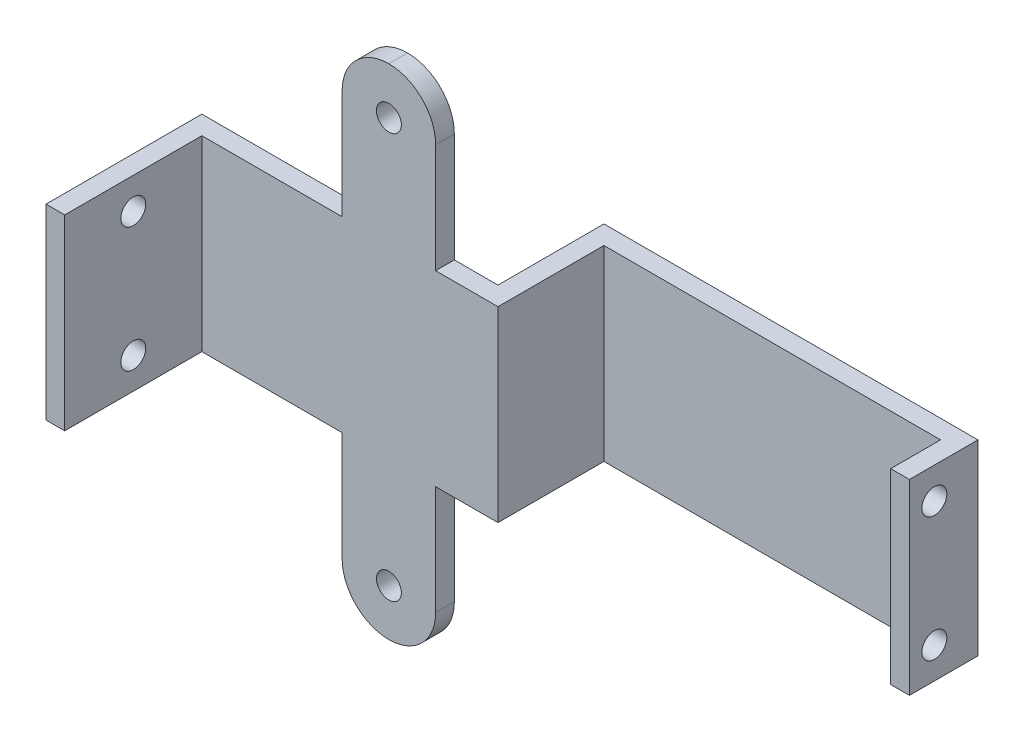
ISO-10303-21;
HEADER;
FILE_DESCRIPTION(('STEP AP214'),'2;1');
FILE_NAME('part.step','',(''),(''),'','','');
FILE_SCHEMA(('AUTOMOTIVE_DESIGN { 1 0 10303 214 1 1 1 1 }'));
ENDSEC;
DATA;
#1=APPLICATION_CONTEXT('core data for automotive mechanical design processes');
#2=APPLICATION_PROTOCOL_DEFINITION('international standard','automotive_design',2000,#1);
#3=PRODUCT_CONTEXT('',#1,'mechanical');
#4=PRODUCT('Part','Part','',(#3));
#5=PRODUCT_RELATED_PRODUCT_CATEGORY('part','',(#4));
#6=PRODUCT_DEFINITION_FORMATION('','',#4);
#7=PRODUCT_DEFINITION_CONTEXT('part definition',#1,'design');
#8=PRODUCT_DEFINITION('design','',#6,#7);
#9=PRODUCT_DEFINITION_SHAPE('','',#8);
#10=(LENGTH_UNIT() NAMED_UNIT(*) SI_UNIT(.MILLI.,.METRE.));
#11=(NAMED_UNIT(*) PLANE_ANGLE_UNIT() SI_UNIT($,.RADIAN.));
#12=(NAMED_UNIT(*) SI_UNIT($,.STERADIAN.) SOLID_ANGLE_UNIT());
#13=UNCERTAINTY_MEASURE_WITH_UNIT(LENGTH_MEASURE(1.E-05),#10,'distance_accuracy_value','');
#14=(GEOMETRIC_REPRESENTATION_CONTEXT(3) GLOBAL_UNCERTAINTY_ASSIGNED_CONTEXT((#13)) GLOBAL_UNIT_ASSIGNED_CONTEXT((#10,
#11,#12)) REPRESENTATION_CONTEXT('',''));
#15=CARTESIAN_POINT('',(0.,0.,0.));
#16=DIRECTION('',(0.,0.,1.));
#17=DIRECTION('',(1.,0.,0.));
#18=AXIS2_PLACEMENT_3D('',#15,#16,#17);
#19=CARTESIAN_POINT('',(0.,30.,0.));
#20=DIRECTION('',(0.,-1.,0.));
#21=DIRECTION('',(0.,0.,-1.));
#22=AXIS2_PLACEMENT_3D('',#19,#20,#21);
#23=PLANE('',#22);
#24=DIRECTION('',(-1.,0.,0.));
#25=VECTOR('',#24,1.);
#26=CARTESIAN_POINT('',(-60.,30.,17.));
#27=LINE('',#26,#25);
#28=CARTESIAN_POINT('',(-60.,30.,17.));
#29=VERTEX_POINT('',#28);
#30=CARTESIAN_POINT('',(-67.,30.,17.));
#31=VERTEX_POINT('',#30);
#32=EDGE_CURVE('E204',#29,#31,#27,.T.);
#33=ORIENTED_EDGE('',*,*,#32,.T.);
#34=DIRECTION('',(0.,0.,1.));
#35=VECTOR('',#34,1.);
#36=CARTESIAN_POINT('',(-67.,30.,0.));
#37=LINE('',#36,#35);
#38=CARTESIAN_POINT('',(-67.,30.,20.));
#39=VERTEX_POINT('',#38);
#40=EDGE_CURVE('E202',#31,#39,#37,.T.);
#41=ORIENTED_EDGE('',*,*,#40,.T.);
#42=DIRECTION('',(1.,0.,0.));
#43=VECTOR('',#42,1.);
#44=CARTESIAN_POINT('',(-57.,30.,20.));
#45=LINE('',#44,#43);
#46=CARTESIAN_POINT('',(-57.,30.,20.));
#47=VERTEX_POINT('',#46);
#48=EDGE_CURVE('E188',#39,#47,#45,.T.);
#49=ORIENTED_EDGE('',*,*,#48,.T.);
#50=DIRECTION('',(0.,0.,-1.));
#51=VECTOR('',#50,1.);
#52=CARTESIAN_POINT('',(-57.,30.,3.00000000000001));
#53=LINE('',#52,#51);
#54=CARTESIAN_POINT('',(-57.,30.,3.00000000000001));
#55=VERTEX_POINT('',#54);
#56=EDGE_CURVE('E287',#47,#55,#53,.T.);
#57=ORIENTED_EDGE('',*,*,#56,.T.);
#58=DIRECTION('',(1.,0.,0.));
#59=VECTOR('',#58,1.);
#60=CARTESIAN_POINT('',(0.,30.,3.));
#61=LINE('',#60,#59);
#62=CARTESIAN_POINT('',(-3.,30.,3.));
#63=VERTEX_POINT('',#62);
#64=EDGE_CURVE('E289',#55,#63,#61,.T.);
#65=ORIENTED_EDGE('',*,*,#64,.T.);
#66=DIRECTION('',(0.,0.,1.));
#67=VECTOR('',#66,1.);
#68=CARTESIAN_POINT('',(-3.,30.,3.00000000000001));
#69=LINE('',#68,#67);
#70=CARTESIAN_POINT('',(-3.,30.,11.));
#71=VERTEX_POINT('',#70);
#72=EDGE_CURVE('E241',#63,#71,#69,.T.);
#73=ORIENTED_EDGE('',*,*,#72,.T.);
#74=DIRECTION('',(1.,0.,0.));
#75=VECTOR('',#74,1.);
#76=CARTESIAN_POINT('',(-3.,30.,11.));
#77=LINE('',#76,#75);
#78=CARTESIAN_POINT('',(0.,30.,11.));
#79=VERTEX_POINT('',#78);
#80=EDGE_CURVE('E250',#71,#79,#77,.T.);
#81=ORIENTED_EDGE('',*,*,#80,.T.);
#82=DIRECTION('',(0.,0.,-1.));
#83=VECTOR('',#82,1.);
#84=CARTESIAN_POINT('',(0.,30.,0.));
#85=LINE('',#84,#83);
#86=CARTESIAN_POINT('',(0.,30.,0.));
#87=VERTEX_POINT('',#86);
#88=EDGE_CURVE('E271',#79,#87,#85,.T.);
#89=ORIENTED_EDGE('',*,*,#88,.T.);
#90=DIRECTION('',(-1.,0.,0.));
#91=VECTOR('',#90,1.);
#92=CARTESIAN_POINT('',(0.,30.,0.));
#93=LINE('',#92,#91);
#94=CARTESIAN_POINT('',(-60.,30.,0.));
#95=VERTEX_POINT('',#94);
#96=EDGE_CURVE('E274',#87,#95,#93,.T.);
#97=ORIENTED_EDGE('',*,*,#96,.T.);
#98=DIRECTION('',(0.,0.,1.));
#99=VECTOR('',#98,1.);
#100=CARTESIAN_POINT('',(-60.,30.,0.));
#101=LINE('',#100,#99);
#102=EDGE_CURVE('E277',#95,#29,#101,.T.);
#103=ORIENTED_EDGE('',*,*,#102,.T.);
#104=EDGE_LOOP('',(#33,#41,#49,#57,#65,#73,#81,#89,#97,#103));
#105=FACE_BOUND('',#104,.T.);
#106=ADVANCED_FACE('F39',(#105),#23,.F.);
#107=CARTESIAN_POINT('',(0.,0.,0.));
#108=DIRECTION('',(0.,-1.,0.));
#109=DIRECTION('',(0.,0.,-1.));
#110=AXIS2_PLACEMENT_3D('',#107,#108,#109);
#111=PLANE('',#110);
#112=DIRECTION('',(0.,0.,1.));
#113=VECTOR('',#112,1.);
#114=CARTESIAN_POINT('',(-67.,0.,0.));
#115=LINE('',#114,#113);
#116=CARTESIAN_POINT('',(-67.,0.,17.));
#117=VERTEX_POINT('',#116);
#118=CARTESIAN_POINT('',(-67.,0.,20.));
#119=VERTEX_POINT('',#118);
#120=EDGE_CURVE('E342',#117,#119,#115,.T.);
#121=ORIENTED_EDGE('',*,*,#120,.F.);
#122=DIRECTION('',(-1.,0.,0.));
#123=VECTOR('',#122,1.);
#124=CARTESIAN_POINT('',(-60.,0.,17.));
#125=LINE('',#124,#123);
#126=CARTESIAN_POINT('',(-60.,0.,17.));
#127=VERTEX_POINT('',#126);
#128=EDGE_CURVE('E300',#127,#117,#125,.T.);
#129=ORIENTED_EDGE('',*,*,#128,.F.);
#130=DIRECTION('',(0.,0.,1.));
#131=VECTOR('',#130,1.);
#132=CARTESIAN_POINT('',(-60.,0.,0.));
#133=LINE('',#132,#131);
#134=CARTESIAN_POINT('',(-60.,0.,0.));
#135=VERTEX_POINT('',#134);
#136=EDGE_CURVE('E297',#135,#127,#133,.T.);
#137=ORIENTED_EDGE('',*,*,#136,.F.);
#138=DIRECTION('',(-1.,0.,0.));
#139=VECTOR('',#138,1.);
#140=CARTESIAN_POINT('',(0.,0.,0.));
#141=LINE('',#140,#139);
#142=CARTESIAN_POINT('',(0.,0.,0.));
#143=VERTEX_POINT('',#142);
#144=EDGE_CURVE('E295',#143,#135,#141,.T.);
#145=ORIENTED_EDGE('',*,*,#144,.F.);
#146=DIRECTION('',(0.,0.,-1.));
#147=VECTOR('',#146,1.);
#148=CARTESIAN_POINT('',(0.,0.,0.));
#149=LINE('',#148,#147);
#150=CARTESIAN_POINT('',(0.,0.,11.));
#151=VERTEX_POINT('',#150);
#152=EDGE_CURVE('E266',#151,#143,#149,.T.);
#153=ORIENTED_EDGE('',*,*,#152,.F.);
#154=DIRECTION('',(1.,0.,0.));
#155=VECTOR('',#154,1.);
#156=CARTESIAN_POINT('',(-3.,0.,11.));
#157=LINE('',#156,#155);
#158=CARTESIAN_POINT('',(-3.,0.,11.));
#159=VERTEX_POINT('',#158);
#160=EDGE_CURVE('E253',#159,#151,#157,.T.);
#161=ORIENTED_EDGE('',*,*,#160,.F.);
#162=DIRECTION('',(0.,0.,-1.));
#163=VECTOR('',#162,1.);
#164=CARTESIAN_POINT('',(-3.,0.,3.00000000000001));
#165=LINE('',#164,#163);
#166=CARTESIAN_POINT('',(-3.,0.,3.));
#167=VERTEX_POINT('',#166);
#168=EDGE_CURVE('E247',#159,#167,#165,.T.);
#169=ORIENTED_EDGE('',*,*,#168,.T.);
#170=DIRECTION('',(1.,0.,0.));
#171=VECTOR('',#170,1.);
#172=CARTESIAN_POINT('',(0.,0.,3.));
#173=LINE('',#172,#171);
#174=CARTESIAN_POINT('',(-57.,0.,3.00000000000001));
#175=VERTEX_POINT('',#174);
#176=EDGE_CURVE('E275',#175,#167,#173,.T.);
#177=ORIENTED_EDGE('',*,*,#176,.F.);
#178=DIRECTION('',(0.,0.,-1.));
#179=VECTOR('',#178,1.);
#180=CARTESIAN_POINT('',(-57.,0.,3.00000000000001));
#181=LINE('',#180,#179);
#182=CARTESIAN_POINT('',(-57.,0.,20.));
#183=VERTEX_POINT('',#182);
#184=EDGE_CURVE('E313',#183,#175,#181,.T.);
#185=ORIENTED_EDGE('',*,*,#184,.F.);
#186=DIRECTION('',(1.,0.,0.));
#187=VECTOR('',#186,1.);
#188=CARTESIAN_POINT('',(-57.,0.,20.));
#189=LINE('',#188,#187);
#190=EDGE_CURVE('E309',#119,#183,#189,.T.);
#191=ORIENTED_EDGE('',*,*,#190,.F.);
#192=EDGE_LOOP('',(#121,#129,#137,#145,#153,#161,#169,#177,#185,#191));
#193=FACE_BOUND('',#192,.T.);
#194=ADVANCED_FACE('F407',(#193),#111,.T.);
#195=CARTESIAN_POINT('',(0.,30.,0.));
#196=DIRECTION('',(-1.,0.,0.));
#197=DIRECTION('',(0.,0.,1.));
#198=AXIS2_PLACEMENT_3D('',#195,#196,#197);
#199=PLANE('',#198);
#200=ORIENTED_EDGE('',*,*,#152,.T.);
#201=DIRECTION('',(0.,-1.,0.));
#202=VECTOR('',#201,1.);
#203=CARTESIAN_POINT('',(0.,30.,0.));
#204=LINE('',#203,#202);
#205=EDGE_CURVE('E337',#87,#143,#204,.T.);
#206=ORIENTED_EDGE('',*,*,#205,.F.);
#207=ORIENTED_EDGE('',*,*,#88,.F.);
#208=DIRECTION('',(0.,-1.,0.));
#209=VECTOR('',#208,1.);
#210=CARTESIAN_POINT('',(0.,30.,11.));
#211=LINE('',#210,#209);
#212=EDGE_CURVE('E236',#79,#151,#211,.T.);
#213=ORIENTED_EDGE('',*,*,#212,.T.);
#214=EDGE_LOOP('',(#200,#206,#207,#213));
#215=FACE_BOUND('',#214,.T.);
#216=CARTESIAN_POINT('',(0.,5.,7.00000000000001));
#217=DIRECTION('',(1.,0.,0.));
#218=DIRECTION('',(0.,0.,-1.));
#219=AXIS2_PLACEMENT_3D('',#216,#217,#218);
#220=CIRCLE('',#219,2.);
#221=CARTESIAN_POINT('',(0.,5.,5.));
#222=VERTEX_POINT('',#221);
#223=EDGE_CURVE('E208',#222,#222,#220,.T.);
#224=ORIENTED_EDGE('',*,*,#223,.F.);
#225=EDGE_LOOP('',(#224));
#226=FACE_BOUND('',#225,.T.);
#227=CARTESIAN_POINT('',(0.,25.,7.00000000000001));
#228=DIRECTION('',(1.,0.,0.));
#229=DIRECTION('',(0.,0.,-1.));
#230=AXIS2_PLACEMENT_3D('',#227,#228,#229);
#231=CIRCLE('',#230,2.);
#232=CARTESIAN_POINT('',(0.,25.,5.));
#233=VERTEX_POINT('',#232);
#234=EDGE_CURVE('E230',#233,#233,#231,.T.);
#235=ORIENTED_EDGE('',*,*,#234,.F.);
#236=EDGE_LOOP('',(#235));
#237=FACE_BOUND('',#236,.T.);
#238=ADVANCED_FACE('F463',(#215,#226,#237),#199,.F.);
#239=CARTESIAN_POINT('',(0.,30.,0.));
#240=DIRECTION('',(0.,0.,1.));
#241=DIRECTION('',(1.,0.,0.));
#242=AXIS2_PLACEMENT_3D('',#239,#240,#241);
#243=PLANE('',#242);
#244=ORIENTED_EDGE('',*,*,#144,.T.);
#245=DIRECTION('',(0.,-1.,0.));
#246=VECTOR('',#245,1.);
#247=CARTESIAN_POINT('',(-60.,30.,0.));
#248=LINE('',#247,#246);
#249=EDGE_CURVE('E334',#95,#135,#248,.T.);
#250=ORIENTED_EDGE('',*,*,#249,.F.);
#251=ORIENTED_EDGE('',*,*,#96,.F.);
#252=ORIENTED_EDGE('',*,*,#205,.T.);
#253=EDGE_LOOP('',(#244,#250,#251,#252));
#254=FACE_BOUND('',#253,.T.);
#255=ADVANCED_FACE('F467',(#254),#243,.F.);
#256=CARTESIAN_POINT('',(-60.,30.,0.));
#257=DIRECTION('',(1.,0.,0.));
#258=DIRECTION('',(0.,0.,-1.));
#259=AXIS2_PLACEMENT_3D('',#256,#257,#258);
#260=PLANE('',#259);
#261=ORIENTED_EDGE('',*,*,#136,.T.);
#262=DIRECTION('',(0.,-1.,0.));
#263=VECTOR('',#262,1.);
#264=CARTESIAN_POINT('',(-60.,30.,17.));
#265=LINE('',#264,#263);
#266=EDGE_CURVE('E331',#29,#127,#265,.T.);
#267=ORIENTED_EDGE('',*,*,#266,.F.);
#268=ORIENTED_EDGE('',*,*,#102,.F.);
#269=ORIENTED_EDGE('',*,*,#249,.T.);
#270=EDGE_LOOP('',(#261,#267,#268,#269));
#271=FACE_BOUND('',#270,.T.);
#272=ADVANCED_FACE('F487',(#271),#260,.F.);
#273=CARTESIAN_POINT('',(-60.,30.,17.));
#274=DIRECTION('',(0.,0.,1.));
#275=DIRECTION('',(1.,0.,0.));
#276=AXIS2_PLACEMENT_3D('',#273,#274,#275);
#277=PLANE('',#276);
#278=CARTESIAN_POINT('',(-74.5,47.5,17.));
#279=DIRECTION('',(0.,0.,1.));
#280=DIRECTION('',(1.,0.,0.));
#281=AXIS2_PLACEMENT_3D('',#278,#279,#280);
#282=CIRCLE('',#281,2.);
#283=CARTESIAN_POINT('',(-72.5,47.5,17.));
#284=VERTEX_POINT('',#283);
#285=EDGE_CURVE('E393',#284,#284,#282,.T.);
#286=ORIENTED_EDGE('',*,*,#285,.T.);
#287=EDGE_LOOP('',(#286));
#288=FACE_BOUND('',#287,.T.);
#289=CARTESIAN_POINT('',(-74.5,-17.5,17.));
#290=DIRECTION('',(0.,0.,1.));
#291=DIRECTION('',(1.,0.,0.));
#292=AXIS2_PLACEMENT_3D('',#289,#290,#291);
#293=CIRCLE('',#292,2.);
#294=CARTESIAN_POINT('',(-72.5,-17.5,17.));
#295=VERTEX_POINT('',#294);
#296=EDGE_CURVE('E384',#295,#295,#293,.T.);
#297=ORIENTED_EDGE('',*,*,#296,.T.);
#298=EDGE_LOOP('',(#297));
#299=FACE_BOUND('',#298,.T.);
#300=DIRECTION('',(0.,1.,0.));
#301=VECTOR('',#300,1.);
#302=CARTESIAN_POINT('',(-67.,-25.,17.));
#303=LINE('',#302,#301);
#304=CARTESIAN_POINT('',(-67.,-17.5,17.));
#305=VERTEX_POINT('',#304);
#306=EDGE_CURVE('E378',#305,#117,#303,.T.);
#307=ORIENTED_EDGE('',*,*,#306,.F.);
#308=CARTESIAN_POINT('',(-74.5,-17.5,17.));
#309=DIRECTION('',(0.,0.,1.));
#310=DIRECTION('',(1.,0.,0.));
#311=AXIS2_PLACEMENT_3D('',#308,#309,#310);
#312=CIRCLE('',#311,7.5);
#313=CARTESIAN_POINT('',(-74.5,-25.,17.));
#314=VERTEX_POINT('',#313);
#315=EDGE_CURVE('E61',#305,#314,#312,.F.);
#316=ORIENTED_EDGE('',*,*,#315,.T.);
#317=CARTESIAN_POINT('',(-74.5,-17.5,17.));
#318=DIRECTION('',(0.,0.,1.));
#319=DIRECTION('',(1.,0.,0.));
#320=AXIS2_PLACEMENT_3D('',#317,#318,#319);
#321=CIRCLE('',#320,7.5);
#322=CARTESIAN_POINT('',(-82.,-17.5,17.));
#323=VERTEX_POINT('',#322);
#324=EDGE_CURVE('E56',#314,#323,#321,.F.);
#325=ORIENTED_EDGE('',*,*,#324,.T.);
#326=DIRECTION('',(0.,-1.,0.));
#327=VECTOR('',#326,1.);
#328=CARTESIAN_POINT('',(-82.,-25.,17.));
#329=LINE('',#328,#327);
#330=CARTESIAN_POINT('',(-82.,0.,17.));
#331=VERTEX_POINT('',#330);
#332=EDGE_CURVE('E377',#331,#323,#329,.T.);
#333=ORIENTED_EDGE('',*,*,#332,.F.);
#334=CARTESIAN_POINT('',(-107.5,0.,17.));
#335=VERTEX_POINT('',#334);
#336=EDGE_CURVE('E299',#331,#335,#125,.T.);
#337=ORIENTED_EDGE('',*,*,#336,.T.);
#338=DIRECTION('',(0.,-1.,0.));
#339=VECTOR('',#338,1.);
#340=CARTESIAN_POINT('',(-107.5,30.,17.));
#341=LINE('',#340,#339);
#342=CARTESIAN_POINT('',(-107.5,30.,17.));
#343=VERTEX_POINT('',#342);
#344=EDGE_CURVE('E328',#343,#335,#341,.T.);
#345=ORIENTED_EDGE('',*,*,#344,.F.);
#346=CARTESIAN_POINT('',(-82.,30.,17.));
#347=VERTEX_POINT('',#346);
#348=EDGE_CURVE('E279',#347,#343,#27,.T.);
#349=ORIENTED_EDGE('',*,*,#348,.F.);
#350=CARTESIAN_POINT('',(-82.,47.5,17.));
#351=VERTEX_POINT('',#350);
#352=EDGE_CURVE('E220',#351,#347,#329,.T.);
#353=ORIENTED_EDGE('',*,*,#352,.F.);
#354=CARTESIAN_POINT('',(-74.5,47.5,17.));
#355=DIRECTION('',(0.,0.,1.));
#356=DIRECTION('',(1.,0.,0.));
#357=AXIS2_PLACEMENT_3D('',#354,#355,#356);
#358=CIRCLE('',#357,7.5);
#359=CARTESIAN_POINT('',(-74.5,55.,17.));
#360=VERTEX_POINT('',#359);
#361=EDGE_CURVE('E358',#351,#360,#358,.F.);
#362=ORIENTED_EDGE('',*,*,#361,.T.);
#363=CARTESIAN_POINT('',(-74.5,47.5,17.));
#364=DIRECTION('',(0.,0.,1.));
#365=DIRECTION('',(1.,0.,0.));
#366=AXIS2_PLACEMENT_3D('',#363,#364,#365);
#367=CIRCLE('',#366,7.5);
#368=CARTESIAN_POINT('',(-67.,47.5,17.));
#369=VERTEX_POINT('',#368);
#370=EDGE_CURVE('E356',#360,#369,#367,.F.);
#371=ORIENTED_EDGE('',*,*,#370,.T.);
#372=EDGE_CURVE('E224',#31,#369,#303,.T.);
#373=ORIENTED_EDGE('',*,*,#372,.F.);
#374=ORIENTED_EDGE('',*,*,#32,.F.);
#375=ORIENTED_EDGE('',*,*,#266,.T.);
#376=ORIENTED_EDGE('',*,*,#128,.T.);
#377=EDGE_LOOP('',(#307,#316,#325,#333,#337,#345,#349,#353,#362,#371,#373,#374,#375,#376));
#378=FACE_BOUND('',#377,.T.);
#379=ADVANCED_FACE('F374',(#288,#299,#378),#277,.F.);
#380=CARTESIAN_POINT('',(-107.5,30.,17.));
#381=DIRECTION('',(1.,0.,0.));
#382=DIRECTION('',(0.,0.,-1.));
#383=AXIS2_PLACEMENT_3D('',#380,#381,#382);
#384=PLANE('',#383);
#385=CARTESIAN_POINT('',(-107.5,25.,31.));
#386=DIRECTION('',(1.,0.,0.));
#387=DIRECTION('',(0.,0.,-1.));
#388=AXIS2_PLACEMENT_3D('',#385,#386,#387);
#389=CIRCLE('',#388,2.);
#390=CARTESIAN_POINT('',(-107.5,25.,29.));
#391=VERTEX_POINT('',#390);
#392=EDGE_CURVE('E262',#391,#391,#389,.F.);
#393=ORIENTED_EDGE('',*,*,#392,.F.);
#394=EDGE_LOOP('',(#393));
#395=FACE_BOUND('',#394,.T.);
#396=CARTESIAN_POINT('',(-107.5,5.,31.));
#397=DIRECTION('',(1.,0.,0.));
#398=DIRECTION('',(0.,0.,-1.));
#399=AXIS2_PLACEMENT_3D('',#396,#397,#398);
#400=CIRCLE('',#399,2.);
#401=CARTESIAN_POINT('',(-107.5,5.,29.));
#402=VERTEX_POINT('',#401);
#403=EDGE_CURVE('E256',#402,#402,#400,.F.);
#404=ORIENTED_EDGE('',*,*,#403,.F.);
#405=EDGE_LOOP('',(#404));
#406=FACE_BOUND('',#405,.T.);
#407=DIRECTION('',(0.,0.,1.));
#408=VECTOR('',#407,1.);
#409=CARTESIAN_POINT('',(-107.5,0.,17.));
#410=LINE('',#409,#408);
#411=CARTESIAN_POINT('',(-107.5,0.,42.));
#412=VERTEX_POINT('',#411);
#413=EDGE_CURVE('E303',#335,#412,#410,.T.);
#414=ORIENTED_EDGE('',*,*,#413,.T.);
#415=DIRECTION('',(0.,-1.,0.));
#416=VECTOR('',#415,1.);
#417=CARTESIAN_POINT('',(-107.5,30.,42.));
#418=LINE('',#417,#416);
#419=CARTESIAN_POINT('',(-107.5,30.,42.));
#420=VERTEX_POINT('',#419);
#421=EDGE_CURVE('E325',#420,#412,#418,.T.);
#422=ORIENTED_EDGE('',*,*,#421,.F.);
#423=DIRECTION('',(0.,0.,1.));
#424=VECTOR('',#423,1.);
#425=CARTESIAN_POINT('',(-107.5,30.,17.));
#426=LINE('',#425,#424);
#427=EDGE_CURVE('E281',#343,#420,#426,.T.);
#428=ORIENTED_EDGE('',*,*,#427,.F.);
#429=ORIENTED_EDGE('',*,*,#344,.T.);
#430=EDGE_LOOP('',(#414,#422,#428,#429));
#431=FACE_BOUND('',#430,.T.);
#432=ADVANCED_FACE('F434',(#395,#406,#431),#384,.F.);
#433=CARTESIAN_POINT('',(-107.5,30.,42.));
#434=DIRECTION('',(0.,0.,-1.));
#435=DIRECTION('',(-1.,0.,0.));
#436=AXIS2_PLACEMENT_3D('',#433,#434,#435);
#437=PLANE('',#436);
#438=DIRECTION('',(1.,0.,0.));
#439=VECTOR('',#438,1.);
#440=CARTESIAN_POINT('',(-107.5,0.,42.));
#441=LINE('',#440,#439);
#442=CARTESIAN_POINT('',(-104.5,0.,42.));
#443=VERTEX_POINT('',#442);
#444=EDGE_CURVE('E305',#412,#443,#441,.T.);
#445=ORIENTED_EDGE('',*,*,#444,.T.);
#446=DIRECTION('',(0.,-1.,0.));
#447=VECTOR('',#446,1.);
#448=CARTESIAN_POINT('',(-104.5,30.,42.));
#449=LINE('',#448,#447);
#450=CARTESIAN_POINT('',(-104.5,30.,42.));
#451=VERTEX_POINT('',#450);
#452=EDGE_CURVE('E322',#451,#443,#449,.T.);
#453=ORIENTED_EDGE('',*,*,#452,.F.);
#454=DIRECTION('',(1.,0.,0.));
#455=VECTOR('',#454,1.);
#456=CARTESIAN_POINT('',(-107.5,30.,42.));
#457=LINE('',#456,#455);
#458=EDGE_CURVE('E283',#420,#451,#457,.T.);
#459=ORIENTED_EDGE('',*,*,#458,.F.);
#460=ORIENTED_EDGE('',*,*,#421,.T.);
#461=EDGE_LOOP('',(#445,#453,#459,#460));
#462=FACE_BOUND('',#461,.T.);
#463=ADVANCED_FACE('F438',(#462),#437,.F.);
#464=CARTESIAN_POINT('',(-104.5,30.,20.));
#465=DIRECTION('',(-1.,0.,0.));
#466=DIRECTION('',(0.,0.,1.));
#467=AXIS2_PLACEMENT_3D('',#464,#465,#466);
#468=PLANE('',#467);
#469=CARTESIAN_POINT('',(-104.5,25.,31.));
#470=DIRECTION('',(1.,0.,0.));
#471=DIRECTION('',(0.,0.,-1.));
#472=AXIS2_PLACEMENT_3D('',#469,#470,#471);
#473=CIRCLE('',#472,2.);
#474=CARTESIAN_POINT('',(-104.5,25.,29.));
#475=VERTEX_POINT('',#474);
#476=EDGE_CURVE('E259',#475,#475,#473,.T.);
#477=ORIENTED_EDGE('',*,*,#476,.F.);
#478=EDGE_LOOP('',(#477));
#479=FACE_BOUND('',#478,.T.);
#480=CARTESIAN_POINT('',(-104.5,5.,31.));
#481=DIRECTION('',(1.,0.,0.));
#482=DIRECTION('',(0.,0.,-1.));
#483=AXIS2_PLACEMENT_3D('',#480,#481,#482);
#484=CIRCLE('',#483,2.);
#485=CARTESIAN_POINT('',(-104.5,5.,29.));
#486=VERTEX_POINT('',#485);
#487=EDGE_CURVE('E263',#486,#486,#484,.T.);
#488=ORIENTED_EDGE('',*,*,#487,.F.);
#489=EDGE_LOOP('',(#488));
#490=FACE_BOUND('',#489,.T.);
#491=DIRECTION('',(0.,0.,-1.));
#492=VECTOR('',#491,1.);
#493=CARTESIAN_POINT('',(-104.5,0.,20.));
#494=LINE('',#493,#492);
#495=CARTESIAN_POINT('',(-104.5,0.,20.));
#496=VERTEX_POINT('',#495);
#497=EDGE_CURVE('E307',#443,#496,#494,.T.);
#498=ORIENTED_EDGE('',*,*,#497,.T.);
#499=DIRECTION('',(0.,-1.,0.));
#500=VECTOR('',#499,1.);
#501=CARTESIAN_POINT('',(-104.5,30.,20.));
#502=LINE('',#501,#500);
#503=CARTESIAN_POINT('',(-104.5,30.,20.));
#504=VERTEX_POINT('',#503);
#505=EDGE_CURVE('E319',#504,#496,#502,.T.);
#506=ORIENTED_EDGE('',*,*,#505,.F.);
#507=DIRECTION('',(0.,0.,-1.));
#508=VECTOR('',#507,1.);
#509=CARTESIAN_POINT('',(-104.5,30.,20.));
#510=LINE('',#509,#508);
#511=EDGE_CURVE('E199',#451,#504,#510,.T.);
#512=ORIENTED_EDGE('',*,*,#511,.F.);
#513=ORIENTED_EDGE('',*,*,#452,.T.);
#514=EDGE_LOOP('',(#498,#506,#512,#513));
#515=FACE_BOUND('',#514,.T.);
#516=ADVANCED_FACE('F442',(#479,#490,#515),#468,.F.);
#517=CARTESIAN_POINT('',(-57.,30.,20.));
#518=DIRECTION('',(0.,0.,-1.));
#519=DIRECTION('',(-1.,0.,0.));
#520=AXIS2_PLACEMENT_3D('',#517,#518,#519);
#521=PLANE('',#520);
#522=CARTESIAN_POINT('',(-74.5,47.5,20.));
#523=DIRECTION('',(0.,0.,1.));
#524=DIRECTION('',(1.,0.,0.));
#525=AXIS2_PLACEMENT_3D('',#522,#523,#524);
#526=CIRCLE('',#525,2.);
#527=CARTESIAN_POINT('',(-72.5,47.5,20.));
#528=VERTEX_POINT('',#527);
#529=EDGE_CURVE('E390',#528,#528,#526,.T.);
#530=ORIENTED_EDGE('',*,*,#529,.F.);
#531=EDGE_LOOP('',(#530));
#532=FACE_BOUND('',#531,.T.);
#533=CARTESIAN_POINT('',(-74.5,-17.5,20.));
#534=DIRECTION('',(0.,0.,1.));
#535=DIRECTION('',(1.,0.,0.));
#536=AXIS2_PLACEMENT_3D('',#533,#534,#535);
#537=CIRCLE('',#536,2.);
#538=CARTESIAN_POINT('',(-72.5,-17.5,20.));
#539=VERTEX_POINT('',#538);
#540=EDGE_CURVE('E387',#539,#539,#537,.T.);
#541=ORIENTED_EDGE('',*,*,#540,.F.);
#542=EDGE_LOOP('',(#541));
#543=FACE_BOUND('',#542,.T.);
#544=CARTESIAN_POINT('',(-74.5,-17.5,20.));
#545=DIRECTION('',(0.,0.,-1.));
#546=DIRECTION('',(-1.,0.,0.));
#547=AXIS2_PLACEMENT_3D('',#544,#545,#546);
#548=CIRCLE('',#547,7.5);
#549=CARTESIAN_POINT('',(-82.,-17.5,20.));
#550=VERTEX_POINT('',#549);
#551=CARTESIAN_POINT('',(-74.5,-25.,20.));
#552=VERTEX_POINT('',#551);
#553=EDGE_CURVE('E349',#550,#552,#548,.F.);
#554=ORIENTED_EDGE('',*,*,#553,.T.);
#555=CARTESIAN_POINT('',(-74.5,-17.5,20.));
#556=DIRECTION('',(0.,0.,-1.));
#557=DIRECTION('',(-1.,0.,0.));
#558=AXIS2_PLACEMENT_3D('',#555,#556,#557);
#559=CIRCLE('',#558,7.5);
#560=CARTESIAN_POINT('',(-67.,-17.5,20.));
#561=VERTEX_POINT('',#560);
#562=EDGE_CURVE('E351',#552,#561,#559,.F.);
#563=ORIENTED_EDGE('',*,*,#562,.T.);
#564=DIRECTION('',(0.,1.,0.));
#565=VECTOR('',#564,1.);
#566=CARTESIAN_POINT('',(-67.,-25.,20.));
#567=LINE('',#566,#565);
#568=EDGE_CURVE('E213',#561,#119,#567,.T.);
#569=ORIENTED_EDGE('',*,*,#568,.T.);
#570=ORIENTED_EDGE('',*,*,#190,.T.);
#571=DIRECTION('',(0.,-1.,0.));
#572=VECTOR('',#571,1.);
#573=CARTESIAN_POINT('',(-57.,30.,20.));
#574=LINE('',#573,#572);
#575=EDGE_CURVE('E195',#47,#183,#574,.T.);
#576=ORIENTED_EDGE('',*,*,#575,.F.);
#577=ORIENTED_EDGE('',*,*,#48,.F.);
#578=CARTESIAN_POINT('',(-67.,47.5,20.));
#579=VERTEX_POINT('',#578);
#580=EDGE_CURVE('E192',#39,#579,#567,.T.);
#581=ORIENTED_EDGE('',*,*,#580,.T.);
#582=CARTESIAN_POINT('',(-74.5,47.5,20.));
#583=DIRECTION('',(0.,0.,-1.));
#584=DIRECTION('',(-1.,0.,0.));
#585=AXIS2_PLACEMENT_3D('',#582,#583,#584);
#586=CIRCLE('',#585,7.5);
#587=CARTESIAN_POINT('',(-74.5,55.,20.));
#588=VERTEX_POINT('',#587);
#589=EDGE_CURVE('E345',#579,#588,#586,.F.);
#590=ORIENTED_EDGE('',*,*,#589,.T.);
#591=CARTESIAN_POINT('',(-74.5,47.5,20.));
#592=DIRECTION('',(0.,0.,-1.));
#593=DIRECTION('',(-1.,0.,0.));
#594=AXIS2_PLACEMENT_3D('',#591,#592,#593);
#595=CIRCLE('',#594,7.5);
#596=CARTESIAN_POINT('',(-82.,47.5,20.));
#597=VERTEX_POINT('',#596);
#598=EDGE_CURVE('E347',#588,#597,#595,.F.);
#599=ORIENTED_EDGE('',*,*,#598,.T.);
#600=DIRECTION('',(0.,-1.,0.));
#601=VECTOR('',#600,1.);
#602=CARTESIAN_POINT('',(-82.,-25.,20.));
#603=LINE('',#602,#601);
#604=CARTESIAN_POINT('',(-82.,30.,20.));
#605=VERTEX_POINT('',#604);
#606=EDGE_CURVE('E222',#597,#605,#603,.T.);
#607=ORIENTED_EDGE('',*,*,#606,.T.);
#608=EDGE_CURVE('E198',#504,#605,#45,.T.);
#609=ORIENTED_EDGE('',*,*,#608,.F.);
#610=ORIENTED_EDGE('',*,*,#505,.T.);
#611=CARTESIAN_POINT('',(-82.,0.,20.));
#612=VERTEX_POINT('',#611);
#613=EDGE_CURVE('E310',#496,#612,#189,.T.);
#614=ORIENTED_EDGE('',*,*,#613,.T.);
#615=EDGE_CURVE('E216',#612,#550,#603,.T.);
#616=ORIENTED_EDGE('',*,*,#615,.T.);
#617=EDGE_LOOP('',(#554,#563,#569,#570,#576,#577,#581,#590,#599,#607,#609,#610,#614,#616));
#618=FACE_BOUND('',#617,.T.);
#619=ADVANCED_FACE('F190',(#532,#543,#618),#521,.F.);
#620=CARTESIAN_POINT('',(-57.,30.,3.00000000000001));
#621=DIRECTION('',(-1.,0.,0.));
#622=DIRECTION('',(0.,0.,1.));
#623=AXIS2_PLACEMENT_3D('',#620,#621,#622);
#624=PLANE('',#623);
#625=ORIENTED_EDGE('',*,*,#184,.T.);
#626=DIRECTION('',(0.,-1.,0.));
#627=VECTOR('',#626,1.);
#628=CARTESIAN_POINT('',(-57.,30.,3.00000000000001));
#629=LINE('',#628,#627);
#630=EDGE_CURVE('E292',#55,#175,#629,.T.);
#631=ORIENTED_EDGE('',*,*,#630,.F.);
#632=ORIENTED_EDGE('',*,*,#56,.F.);
#633=ORIENTED_EDGE('',*,*,#575,.T.);
#634=EDGE_LOOP('',(#625,#631,#632,#633));
#635=FACE_BOUND('',#634,.T.);
#636=ADVANCED_FACE('F455',(#635),#624,.F.);
#637=CARTESIAN_POINT('',(0.,30.,3.));
#638=DIRECTION('',(0.,0.,-1.));
#639=DIRECTION('',(-1.,0.,0.));
#640=AXIS2_PLACEMENT_3D('',#637,#638,#639);
#641=PLANE('',#640);
#642=ORIENTED_EDGE('',*,*,#176,.T.);
#643=DIRECTION('',(0.,1.,0.));
#644=VECTOR('',#643,1.);
#645=CARTESIAN_POINT('',(-3.,30.,3.00000000000001));
#646=LINE('',#645,#644);
#647=EDGE_CURVE('E239',#167,#63,#646,.T.);
#648=ORIENTED_EDGE('',*,*,#647,.T.);
#649=ORIENTED_EDGE('',*,*,#64,.F.);
#650=ORIENTED_EDGE('',*,*,#630,.T.);
#651=EDGE_LOOP('',(#642,#648,#649,#650));
#652=FACE_BOUND('',#651,.T.);
#653=ADVANCED_FACE('F446',(#652),#641,.F.);
#654=ORIENTED_EDGE('',*,*,#608,.T.);
#655=DIRECTION('',(0.,0.,-1.));
#656=VECTOR('',#655,1.);
#657=CARTESIAN_POINT('',(-82.,30.,0.));
#658=LINE('',#657,#656);
#659=EDGE_CURVE('E209',#605,#347,#658,.T.);
#660=ORIENTED_EDGE('',*,*,#659,.T.);
#661=ORIENTED_EDGE('',*,*,#348,.T.);
#662=ORIENTED_EDGE('',*,*,#427,.T.);
#663=ORIENTED_EDGE('',*,*,#458,.T.);
#664=ORIENTED_EDGE('',*,*,#511,.T.);
#665=EDGE_LOOP('',(#654,#660,#661,#662,#663,#664));
#666=FACE_BOUND('',#665,.T.);
#667=ADVANCED_FACE('F444',(#666),#23,.F.);
#668=DIRECTION('',(0.,0.,-1.));
#669=VECTOR('',#668,1.);
#670=CARTESIAN_POINT('',(-82.,0.,0.));
#671=LINE('',#670,#669);
#672=EDGE_CURVE('E340',#612,#331,#671,.T.);
#673=ORIENTED_EDGE('',*,*,#672,.F.);
#674=ORIENTED_EDGE('',*,*,#613,.F.);
#675=ORIENTED_EDGE('',*,*,#497,.F.);
#676=ORIENTED_EDGE('',*,*,#444,.F.);
#677=ORIENTED_EDGE('',*,*,#413,.F.);
#678=ORIENTED_EDGE('',*,*,#336,.F.);
#679=EDGE_LOOP('',(#673,#674,#675,#676,#677,#678));
#680=FACE_BOUND('',#679,.T.);
#681=ADVANCED_FACE('F428',(#680),#111,.T.);
#682=CARTESIAN_POINT('',(-113.156854249492,5.,31.));
#683=DIRECTION('',(1.,0.,0.));
#684=DIRECTION('',(0.,0.,-1.));
#685=AXIS2_PLACEMENT_3D('',#682,#683,#684);
#686=CYLINDRICAL_SURFACE('',#685,2.);
#687=ORIENTED_EDGE('',*,*,#403,.T.);
#688=EDGE_LOOP('',(#687));
#689=FACE_BOUND('',#688,.T.);
#690=ORIENTED_EDGE('',*,*,#487,.T.);
#691=EDGE_LOOP('',(#690));
#692=FACE_BOUND('',#691,.T.);
#693=ADVANCED_FACE('F452',(#689,#692),#686,.F.);
#694=CARTESIAN_POINT('',(-113.156854249492,25.,31.));
#695=DIRECTION('',(1.,0.,0.));
#696=DIRECTION('',(0.,0.,-1.));
#697=AXIS2_PLACEMENT_3D('',#694,#695,#696);
#698=CYLINDRICAL_SURFACE('',#697,2.);
#699=ORIENTED_EDGE('',*,*,#392,.T.);
#700=EDGE_LOOP('',(#699));
#701=FACE_BOUND('',#700,.T.);
#702=ORIENTED_EDGE('',*,*,#476,.T.);
#703=EDGE_LOOP('',(#702));
#704=FACE_BOUND('',#703,.T.);
#705=ADVANCED_FACE('F569',(#701,#704),#698,.F.);
#706=CARTESIAN_POINT('',(-3.,30.,11.));
#707=DIRECTION('',(0.,0.,1.));
#708=DIRECTION('',(0.,-1.,0.));
#709=AXIS2_PLACEMENT_3D('',#706,#707,#708);
#710=PLANE('',#709);
#711=ORIENTED_EDGE('',*,*,#212,.F.);
#712=ORIENTED_EDGE('',*,*,#80,.F.);
#713=DIRECTION('',(0.,-1.,0.));
#714=VECTOR('',#713,1.);
#715=CARTESIAN_POINT('',(-3.,30.,11.));
#716=LINE('',#715,#714);
#717=EDGE_CURVE('E244',#71,#159,#716,.T.);
#718=ORIENTED_EDGE('',*,*,#717,.T.);
#719=ORIENTED_EDGE('',*,*,#160,.T.);
#720=EDGE_LOOP('',(#711,#712,#718,#719));
#721=FACE_BOUND('',#720,.T.);
#722=ADVANCED_FACE('F562',(#721),#710,.T.);
#723=CARTESIAN_POINT('',(-3.,0.,0.));
#724=DIRECTION('',(-1.,0.,0.));
#725=DIRECTION('',(0.,0.,1.));
#726=AXIS2_PLACEMENT_3D('',#723,#724,#725);
#727=PLANE('',#726);
#728=CARTESIAN_POINT('',(-3.,5.,7.00000000000001));
#729=DIRECTION('',(1.,0.,0.));
#730=DIRECTION('',(0.,0.,-1.));
#731=AXIS2_PLACEMENT_3D('',#728,#729,#730);
#732=CIRCLE('',#731,2.);
#733=CARTESIAN_POINT('',(-3.,5.,5.));
#734=VERTEX_POINT('',#733);
#735=EDGE_CURVE('E227',#734,#734,#732,.T.);
#736=ORIENTED_EDGE('',*,*,#735,.T.);
#737=EDGE_LOOP('',(#736));
#738=FACE_BOUND('',#737,.T.);
#739=CARTESIAN_POINT('',(-3.,25.,7.00000000000001));
#740=DIRECTION('',(1.,0.,0.));
#741=DIRECTION('',(0.,0.,-1.));
#742=AXIS2_PLACEMENT_3D('',#739,#740,#741);
#743=CIRCLE('',#742,2.);
#744=CARTESIAN_POINT('',(-3.,25.,5.));
#745=VERTEX_POINT('',#744);
#746=EDGE_CURVE('E233',#745,#745,#743,.T.);
#747=ORIENTED_EDGE('',*,*,#746,.T.);
#748=EDGE_LOOP('',(#747));
#749=FACE_BOUND('',#748,.T.);
#750=ORIENTED_EDGE('',*,*,#647,.F.);
#751=ORIENTED_EDGE('',*,*,#168,.F.);
#752=ORIENTED_EDGE('',*,*,#717,.F.);
#753=ORIENTED_EDGE('',*,*,#72,.F.);
#754=EDGE_LOOP('',(#750,#751,#752,#753));
#755=FACE_BOUND('',#754,.T.);
#756=ADVANCED_FACE('F568',(#738,#749,#755),#727,.T.);
#757=CARTESIAN_POINT('',(-3.,25.,7.00000000000001));
#758=DIRECTION('',(1.,0.,0.));
#759=DIRECTION('',(0.,0.,-1.));
#760=AXIS2_PLACEMENT_3D('',#757,#758,#759);
#761=CYLINDRICAL_SURFACE('',#760,2.);
#762=ORIENTED_EDGE('',*,*,#746,.F.);
#763=EDGE_LOOP('',(#762));
#764=FACE_BOUND('',#763,.T.);
#765=ORIENTED_EDGE('',*,*,#234,.T.);
#766=EDGE_LOOP('',(#765));
#767=FACE_BOUND('',#766,.T.);
#768=ADVANCED_FACE('F580',(#764,#767),#761,.F.);
#769=CARTESIAN_POINT('',(-3.,5.,7.00000000000001));
#770=DIRECTION('',(1.,0.,0.));
#771=DIRECTION('',(0.,0.,-1.));
#772=AXIS2_PLACEMENT_3D('',#769,#770,#771);
#773=CYLINDRICAL_SURFACE('',#772,2.);
#774=ORIENTED_EDGE('',*,*,#735,.F.);
#775=EDGE_LOOP('',(#774));
#776=FACE_BOUND('',#775,.T.);
#777=ORIENTED_EDGE('',*,*,#223,.T.);
#778=EDGE_LOOP('',(#777));
#779=FACE_BOUND('',#778,.T.);
#780=ADVANCED_FACE('F543',(#776,#779),#773,.F.);
#781=CARTESIAN_POINT('',(-82.,-25.,17.));
#782=DIRECTION('',(-1.,0.,0.));
#783=DIRECTION('',(0.,0.,1.));
#784=AXIS2_PLACEMENT_3D('',#781,#782,#783);
#785=PLANE('',#784);
#786=ORIENTED_EDGE('',*,*,#332,.T.);
#787=DIRECTION('',(0.,0.,1.));
#788=VECTOR('',#787,1.);
#789=CARTESIAN_POINT('',(-82.,-17.5,17.));
#790=LINE('',#789,#788);
#791=EDGE_CURVE('E362',#323,#550,#790,.T.);
#792=ORIENTED_EDGE('',*,*,#791,.T.);
#793=ORIENTED_EDGE('',*,*,#615,.F.);
#794=ORIENTED_EDGE('',*,*,#672,.T.);
#795=EDGE_LOOP('',(#786,#792,#793,#794));
#796=FACE_BOUND('',#795,.T.);
#797=ADVANCED_FACE('F421',(#796),#785,.T.);
#798=CARTESIAN_POINT('',(-67.,-25.,17.));
#799=DIRECTION('',(1.,0.,0.));
#800=DIRECTION('',(0.,0.,-1.));
#801=AXIS2_PLACEMENT_3D('',#798,#799,#800);
#802=PLANE('',#801);
#803=ORIENTED_EDGE('',*,*,#568,.F.);
#804=DIRECTION('',(0.,0.,1.));
#805=VECTOR('',#804,1.);
#806=CARTESIAN_POINT('',(-67.,-17.5,17.));
#807=LINE('',#806,#805);
#808=EDGE_CURVE('E353',#561,#305,#807,.F.);
#809=ORIENTED_EDGE('',*,*,#808,.T.);
#810=ORIENTED_EDGE('',*,*,#306,.T.);
#811=ORIENTED_EDGE('',*,*,#120,.T.);
#812=EDGE_LOOP('',(#803,#809,#810,#811));
#813=FACE_BOUND('',#812,.T.);
#814=ADVANCED_FACE('F411',(#813),#802,.T.);
#815=ORIENTED_EDGE('',*,*,#372,.T.);
#816=DIRECTION('',(0.,0.,1.));
#817=VECTOR('',#816,1.);
#818=CARTESIAN_POINT('',(-67.,47.5,17.));
#819=LINE('',#818,#817);
#820=EDGE_CURVE('E11',#369,#579,#819,.T.);
#821=ORIENTED_EDGE('',*,*,#820,.T.);
#822=ORIENTED_EDGE('',*,*,#580,.F.);
#823=ORIENTED_EDGE('',*,*,#40,.F.);
#824=EDGE_LOOP('',(#815,#821,#822,#823));
#825=FACE_BOUND('',#824,.T.);
#826=ADVANCED_FACE('F211',(#825),#802,.T.);
#827=ORIENTED_EDGE('',*,*,#606,.F.);
#828=DIRECTION('',(0.,0.,1.));
#829=VECTOR('',#828,1.);
#830=CARTESIAN_POINT('',(-82.,47.5,17.));
#831=LINE('',#830,#829);
#832=EDGE_CURVE('E48',#597,#351,#831,.F.);
#833=ORIENTED_EDGE('',*,*,#832,.T.);
#834=ORIENTED_EDGE('',*,*,#352,.T.);
#835=ORIENTED_EDGE('',*,*,#659,.F.);
#836=EDGE_LOOP('',(#827,#833,#834,#835));
#837=FACE_BOUND('',#836,.T.);
#838=ADVANCED_FACE('F369',(#837),#785,.T.);
#839=CARTESIAN_POINT('',(-74.5,-17.5,17.));
#840=DIRECTION('',(0.,0.,1.));
#841=DIRECTION('',(1.,0.,0.));
#842=AXIS2_PLACEMENT_3D('',#839,#840,#841);
#843=CYLINDRICAL_SURFACE('',#842,7.5);
#844=ORIENTED_EDGE('',*,*,#791,.F.);
#845=ORIENTED_EDGE('',*,*,#324,.F.);
#846=DIRECTION('',(0.,0.,1.));
#847=VECTOR('',#846,1.);
#848=CARTESIAN_POINT('',(-74.5,-25.,17.));
#849=LINE('',#848,#847);
#850=EDGE_CURVE('E214',#552,#314,#849,.F.);
#851=ORIENTED_EDGE('',*,*,#850,.F.);
#852=ORIENTED_EDGE('',*,*,#553,.F.);
#853=EDGE_LOOP('',(#844,#845,#851,#852));
#854=FACE_BOUND('',#853,.T.);
#855=ADVANCED_FACE('F419',(#854),#843,.T.);
#856=CARTESIAN_POINT('',(-74.5,-17.5,17.));
#857=DIRECTION('',(0.,0.,1.));
#858=DIRECTION('',(1.,0.,0.));
#859=AXIS2_PLACEMENT_3D('',#856,#857,#858);
#860=CYLINDRICAL_SURFACE('',#859,7.5);
#861=ORIENTED_EDGE('',*,*,#315,.F.);
#862=ORIENTED_EDGE('',*,*,#808,.F.);
#863=ORIENTED_EDGE('',*,*,#562,.F.);
#864=ORIENTED_EDGE('',*,*,#850,.T.);
#865=EDGE_LOOP('',(#861,#862,#863,#864));
#866=FACE_BOUND('',#865,.T.);
#867=ADVANCED_FACE('F415',(#866),#860,.T.);
#868=CARTESIAN_POINT('',(-74.5,47.5,17.));
#869=DIRECTION('',(0.,0.,1.));
#870=DIRECTION('',(1.,0.,0.));
#871=AXIS2_PLACEMENT_3D('',#868,#869,#870);
#872=CYLINDRICAL_SURFACE('',#871,7.5);
#873=ORIENTED_EDGE('',*,*,#820,.F.);
#874=ORIENTED_EDGE('',*,*,#370,.F.);
#875=DIRECTION('',(0.,0.,1.));
#876=VECTOR('',#875,1.);
#877=CARTESIAN_POINT('',(-74.5,55.,17.));
#878=LINE('',#877,#876);
#879=EDGE_CURVE('E43',#588,#360,#878,.F.);
#880=ORIENTED_EDGE('',*,*,#879,.F.);
#881=ORIENTED_EDGE('',*,*,#589,.F.);
#882=EDGE_LOOP('',(#873,#874,#880,#881));
#883=FACE_BOUND('',#882,.T.);
#884=ADVANCED_FACE('F41',(#883),#872,.T.);
#885=CARTESIAN_POINT('',(-74.5,47.5,17.));
#886=DIRECTION('',(0.,0.,1.));
#887=DIRECTION('',(1.,0.,0.));
#888=AXIS2_PLACEMENT_3D('',#885,#886,#887);
#889=CYLINDRICAL_SURFACE('',#888,7.5);
#890=ORIENTED_EDGE('',*,*,#361,.F.);
#891=ORIENTED_EDGE('',*,*,#832,.F.);
#892=ORIENTED_EDGE('',*,*,#598,.F.);
#893=ORIENTED_EDGE('',*,*,#879,.T.);
#894=EDGE_LOOP('',(#890,#891,#892,#893));
#895=FACE_BOUND('',#894,.T.);
#896=ADVANCED_FACE('F399',(#895),#889,.T.);
#897=CARTESIAN_POINT('',(-74.5,-17.5,17.));
#898=DIRECTION('',(0.,0.,1.));
#899=DIRECTION('',(1.,0.,0.));
#900=AXIS2_PLACEMENT_3D('',#897,#898,#899);
#901=CYLINDRICAL_SURFACE('',#900,2.);
#902=ORIENTED_EDGE('',*,*,#296,.F.);
#903=EDGE_LOOP('',(#902));
#904=FACE_BOUND('',#903,.T.);
#905=ORIENTED_EDGE('',*,*,#540,.T.);
#906=EDGE_LOOP('',(#905));
#907=FACE_BOUND('',#906,.T.);
#908=ADVANCED_FACE('F497',(#904,#907),#901,.F.);
#909=CARTESIAN_POINT('',(-74.5,47.5,17.));
#910=DIRECTION('',(0.,0.,1.));
#911=DIRECTION('',(1.,0.,0.));
#912=AXIS2_PLACEMENT_3D('',#909,#910,#911);
#913=CYLINDRICAL_SURFACE('',#912,2.);
#914=ORIENTED_EDGE('',*,*,#285,.F.);
#915=EDGE_LOOP('',(#914));
#916=FACE_BOUND('',#915,.T.);
#917=ORIENTED_EDGE('',*,*,#529,.T.);
#918=EDGE_LOOP('',(#917));
#919=FACE_BOUND('',#918,.T.);
#920=ADVANCED_FACE('F502',(#916,#919),#913,.F.);
#921=CLOSED_SHELL('',(#106,#194,#238,#255,#272,#379,#432,#463,#516,#619,#636,#653,#667,#681,
#693,#705,#722,#756,#768,#780,#797,#814,#826,#838,#855,#867,#884,#896,#908,#920));
#922=MANIFOLD_SOLID_BREP('B2',#921);
#923=ADVANCED_BREP_SHAPE_REPRESENTATION('',(#18,#922),#14);
#924=SHAPE_DEFINITION_REPRESENTATION(#9,#923);
ENDSEC;
END-ISO-10303-21;
